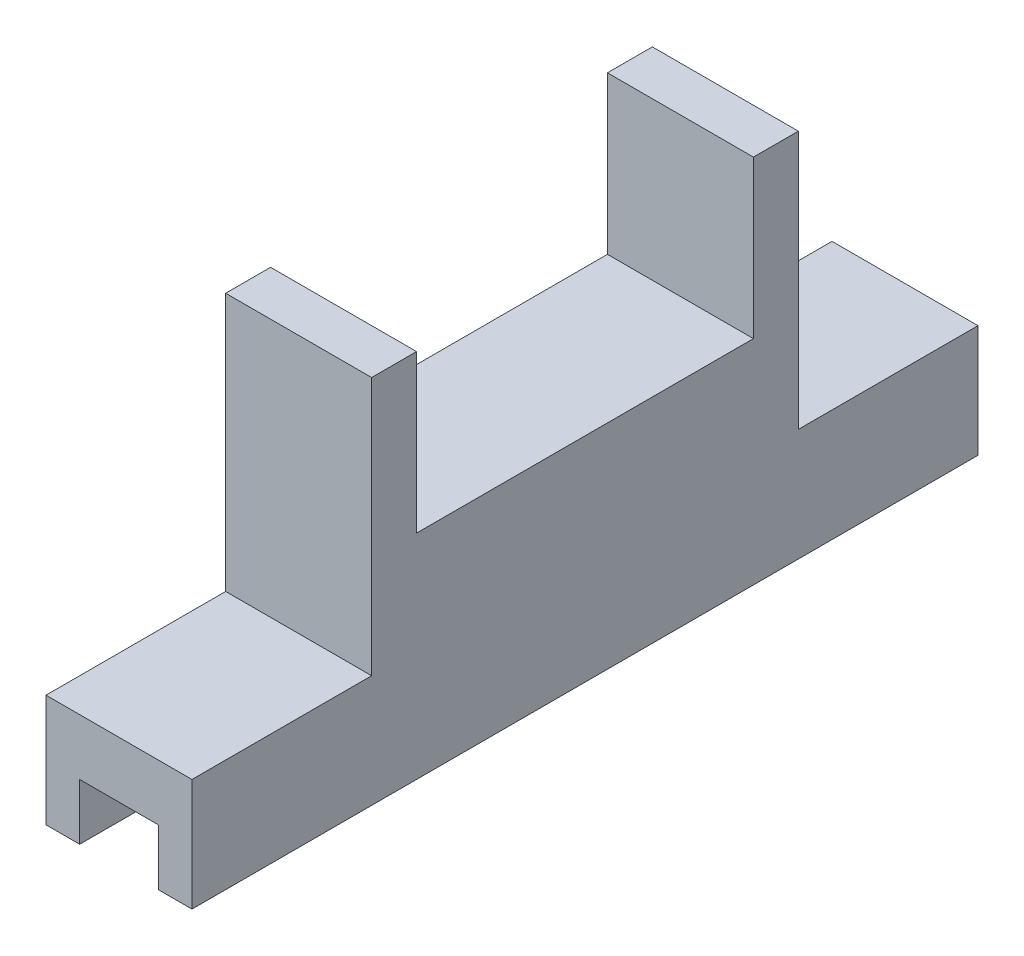
ISO-10303-21;
HEADER;
FILE_DESCRIPTION(('STEP AP214'),'2;1');
FILE_NAME('part.step','',(''),(''),'','','');
FILE_SCHEMA(('AUTOMOTIVE_DESIGN { 1 0 10303 214 1 1 1 1 }'));
ENDSEC;
DATA;
#1=APPLICATION_CONTEXT('core data for automotive mechanical design processes');
#2=APPLICATION_PROTOCOL_DEFINITION('international standard','automotive_design',2000,#1);
#3=PRODUCT_CONTEXT('',#1,'mechanical');
#4=PRODUCT('Part','Part','',(#3));
#5=PRODUCT_RELATED_PRODUCT_CATEGORY('part','',(#4));
#6=PRODUCT_DEFINITION_FORMATION('','',#4);
#7=PRODUCT_DEFINITION_CONTEXT('part definition',#1,'design');
#8=PRODUCT_DEFINITION('design','',#6,#7);
#9=PRODUCT_DEFINITION_SHAPE('','',#8);
#10=(LENGTH_UNIT() NAMED_UNIT(*) SI_UNIT(.MILLI.,.METRE.));
#11=(NAMED_UNIT(*) PLANE_ANGLE_UNIT() SI_UNIT($,.RADIAN.));
#12=(NAMED_UNIT(*) SI_UNIT($,.STERADIAN.) SOLID_ANGLE_UNIT());
#13=UNCERTAINTY_MEASURE_WITH_UNIT(LENGTH_MEASURE(1.E-05),#10,'distance_accuracy_value','');
#14=(GEOMETRIC_REPRESENTATION_CONTEXT(3) GLOBAL_UNCERTAINTY_ASSIGNED_CONTEXT((#13)) GLOBAL_UNIT_ASSIGNED_CONTEXT((#10,
#11,#12)) REPRESENTATION_CONTEXT('',''));
#15=CARTESIAN_POINT('',(0.,0.,0.));
#16=DIRECTION('',(0.,0.,1.));
#17=DIRECTION('',(1.,0.,0.));
#18=AXIS2_PLACEMENT_3D('',#15,#16,#17);
#19=CARTESIAN_POINT('',(0.,6.,0.));
#20=DIRECTION('',(0.,1.,0.));
#21=DIRECTION('',(0.,0.,1.));
#22=AXIS2_PLACEMENT_3D('',#19,#20,#21);
#23=PLANE('',#22);
#24=DIRECTION('',(0.,0.,-1.));
#25=VECTOR('',#24,1.);
#26=CARTESIAN_POINT('',(-15.6062671113895,6.,-27.7441860465116));
#27=LINE('',#26,#25);
#28=CARTESIAN_POINT('',(-15.6062671113895,6.,7.25581395348837));
#29=VERTEX_POINT('',#28);
#30=CARTESIAN_POINT('',(-15.6062671113895,6.,-0.744186046511637));
#31=VERTEX_POINT('',#30);
#32=EDGE_CURVE('E203',#29,#31,#27,.T.);
#33=ORIENTED_EDGE('',*,*,#32,.T.);
#34=DIRECTION('',(1.,0.,0.));
#35=VECTOR('',#34,1.);
#36=CARTESIAN_POINT('',(-15.6062671113895,6.,-0.744186046511637));
#37=LINE('',#36,#35);
#38=CARTESIAN_POINT('',(-22.1062671113895,6.,-0.744186046511637));
#39=VERTEX_POINT('',#38);
#40=EDGE_CURVE('E236',#39,#31,#37,.T.);
#41=ORIENTED_EDGE('',*,*,#40,.F.);
#42=DIRECTION('',(0.,0.,1.));
#43=VECTOR('',#42,1.);
#44=CARTESIAN_POINT('',(-22.1062671113895,6.,-27.7441860465116));
#45=LINE('',#44,#43);
#46=CARTESIAN_POINT('',(-22.1062671113895,6.,7.25581395348837));
#47=VERTEX_POINT('',#46);
#48=EDGE_CURVE('E197',#39,#47,#45,.T.);
#49=ORIENTED_EDGE('',*,*,#48,.T.);
#50=DIRECTION('',(1.,0.,0.));
#51=VECTOR('',#50,1.);
#52=CARTESIAN_POINT('',(-22.1062671113895,6.,7.25581395348837));
#53=LINE('',#52,#51);
#54=EDGE_CURVE('E200',#47,#29,#53,.T.);
#55=ORIENTED_EDGE('',*,*,#54,.T.);
#56=EDGE_LOOP('',(#33,#41,#49,#55));
#57=FACE_BOUND('',#56,.T.);
#58=ADVANCED_FACE('F34',(#57),#23,.T.);
#59=CARTESIAN_POINT('',(-22.1062671113895,6.,-27.7441860465116));
#60=VERTEX_POINT('',#59);
#61=CARTESIAN_POINT('',(-22.1062671113895,6.,-19.7441860465116));
#62=VERTEX_POINT('',#61);
#63=EDGE_CURVE('E198',#60,#62,#45,.T.);
#64=ORIENTED_EDGE('',*,*,#63,.T.);
#65=DIRECTION('',(-1.,0.,0.));
#66=VECTOR('',#65,1.);
#67=CARTESIAN_POINT('',(-15.6062671113895,6.,-19.7441860465116));
#68=LINE('',#67,#66);
#69=CARTESIAN_POINT('',(-15.6062671113895,6.,-19.7441860465116));
#70=VERTEX_POINT('',#69);
#71=EDGE_CURVE('E262',#70,#62,#68,.T.);
#72=ORIENTED_EDGE('',*,*,#71,.F.);
#73=CARTESIAN_POINT('',(-15.6062671113895,6.,-27.7441860465116));
#74=VERTEX_POINT('',#73);
#75=EDGE_CURVE('E202',#70,#74,#27,.T.);
#76=ORIENTED_EDGE('',*,*,#75,.T.);
#77=DIRECTION('',(-1.,0.,0.));
#78=VECTOR('',#77,1.);
#79=CARTESIAN_POINT('',(-22.1062671113895,6.,-27.7441860465116));
#80=LINE('',#79,#78);
#81=EDGE_CURVE('E57',#74,#60,#80,.T.);
#82=ORIENTED_EDGE('',*,*,#81,.T.);
#83=EDGE_LOOP('',(#64,#72,#76,#82));
#84=FACE_BOUND('',#83,.T.);
#85=ADVANCED_FACE('F287',(#84),#23,.T.);
#86=CARTESIAN_POINT('',(-22.1062671113895,6.,-27.7441860465116));
#87=DIRECTION('',(1.,0.,0.));
#88=DIRECTION('',(0.,0.,-1.));
#89=AXIS2_PLACEMENT_3D('',#86,#87,#88);
#90=PLANE('',#89);
#91=ORIENTED_EDGE('',*,*,#48,.F.);
#92=DIRECTION('',(0.,-1.,0.));
#93=VECTOR('',#92,1.);
#94=CARTESIAN_POINT('',(-22.1062671113895,17.5,-0.744186046511637));
#95=LINE('',#94,#93);
#96=CARTESIAN_POINT('',(-22.1062671113895,17.5,-0.744186046511637));
#97=VERTEX_POINT('',#96);
#98=EDGE_CURVE('E255',#97,#39,#95,.T.);
#99=ORIENTED_EDGE('',*,*,#98,.F.);
#100=DIRECTION('',(0.,0.,1.));
#101=VECTOR('',#100,1.);
#102=CARTESIAN_POINT('',(-22.1062671113895,17.5,-2.74418604651164));
#103=LINE('',#102,#101);
#104=CARTESIAN_POINT('',(-22.1062671113895,17.5,-2.74418604651164));
#105=VERTEX_POINT('',#104);
#106=EDGE_CURVE('E247',#105,#97,#103,.T.);
#107=ORIENTED_EDGE('',*,*,#106,.F.);
#108=DIRECTION('',(0.,-1.,0.));
#109=VECTOR('',#108,1.);
#110=CARTESIAN_POINT('',(-22.1062671113895,17.5,-2.74418604651164));
#111=LINE('',#110,#109);
#112=CARTESIAN_POINT('',(-22.1062671113895,10.5,-2.74418604651164));
#113=VERTEX_POINT('',#112);
#114=EDGE_CURVE('E257',#105,#113,#111,.T.);
#115=ORIENTED_EDGE('',*,*,#114,.T.);
#116=DIRECTION('',(0.,0.,1.));
#117=VECTOR('',#116,1.);
#118=CARTESIAN_POINT('',(-22.1062671113895,10.5,-17.7441860465116));
#119=LINE('',#118,#117);
#120=CARTESIAN_POINT('',(-22.1062671113895,10.5,-17.7441860465116));
#121=VERTEX_POINT('',#120);
#122=EDGE_CURVE('E185',#121,#113,#119,.T.);
#123=ORIENTED_EDGE('',*,*,#122,.F.);
#124=DIRECTION('',(0.,-1.,0.));
#125=VECTOR('',#124,1.);
#126=CARTESIAN_POINT('',(-22.1062671113895,17.5,-17.7441860465116));
#127=LINE('',#126,#125);
#128=CARTESIAN_POINT('',(-22.1062671113895,17.5,-17.7441860465116));
#129=VERTEX_POINT('',#128);
#130=EDGE_CURVE('E276',#129,#121,#127,.T.);
#131=ORIENTED_EDGE('',*,*,#130,.F.);
#132=DIRECTION('',(0.,0.,1.));
#133=VECTOR('',#132,1.);
#134=CARTESIAN_POINT('',(-22.1062671113895,17.5,-19.7441860465116));
#135=LINE('',#134,#133);
#136=CARTESIAN_POINT('',(-22.1062671113895,17.5,-19.7441860465116));
#137=VERTEX_POINT('',#136);
#138=EDGE_CURVE('E268',#137,#129,#135,.T.);
#139=ORIENTED_EDGE('',*,*,#138,.F.);
#140=DIRECTION('',(0.,-1.,0.));
#141=VECTOR('',#140,1.);
#142=CARTESIAN_POINT('',(-22.1062671113895,17.5,-19.7441860465116));
#143=LINE('',#142,#141);
#144=EDGE_CURVE('E277',#137,#62,#143,.T.);
#145=ORIENTED_EDGE('',*,*,#144,.T.);
#146=ORIENTED_EDGE('',*,*,#63,.F.);
#147=DIRECTION('',(0.,-1.,0.));
#148=VECTOR('',#147,1.);
#149=CARTESIAN_POINT('',(-22.1062671113895,6.,-27.7441860465116));
#150=LINE('',#149,#148);
#151=CARTESIAN_POINT('',(-22.1062671113895,1.,-27.7441860465116));
#152=VERTEX_POINT('',#151);
#153=EDGE_CURVE('E207',#60,#152,#150,.T.);
#154=ORIENTED_EDGE('',*,*,#153,.T.);
#155=DIRECTION('',(0.,0.,1.));
#156=VECTOR('',#155,1.);
#157=CARTESIAN_POINT('',(-22.1062671113895,1.,-496.244186046512));
#158=LINE('',#157,#156);
#159=CARTESIAN_POINT('',(-22.1062671113895,1.,7.25581395348837));
#160=VERTEX_POINT('',#159);
#161=EDGE_CURVE('E174',#152,#160,#158,.T.);
#162=ORIENTED_EDGE('',*,*,#161,.T.);
#163=DIRECTION('',(0.,-1.,0.));
#164=VECTOR('',#163,1.);
#165=CARTESIAN_POINT('',(-22.1062671113895,6.,7.25581395348837));
#166=LINE('',#165,#164);
#167=EDGE_CURVE('E215',#47,#160,#166,.T.);
#168=ORIENTED_EDGE('',*,*,#167,.F.);
#169=EDGE_LOOP('',(#91,#99,#107,#115,#123,#131,#139,#145,#146,#154,#162,#168));
#170=FACE_BOUND('',#169,.T.);
#171=ADVANCED_FACE('F36',(#170),#90,.F.);
#172=CARTESIAN_POINT('',(-22.1062671113895,6.,7.25581395348837));
#173=DIRECTION('',(0.,0.,-1.));
#174=DIRECTION('',(-1.,0.,0.));
#175=AXIS2_PLACEMENT_3D('',#172,#173,#174);
#176=PLANE('',#175);
#177=DIRECTION('',(-1.,0.,0.));
#178=VECTOR('',#177,1.);
#179=CARTESIAN_POINT('',(-22.1062671113895,1.,7.25581395348837));
#180=LINE('',#179,#178);
#181=CARTESIAN_POINT('',(-20.6062671113895,1.,7.25581395348837));
#182=VERTEX_POINT('',#181);
#183=EDGE_CURVE('E172',#182,#160,#180,.T.);
#184=ORIENTED_EDGE('',*,*,#183,.F.);
#185=DIRECTION('',(0.,-1.,0.));
#186=VECTOR('',#185,1.);
#187=CARTESIAN_POINT('',(-20.6062671113895,3.5,7.25581395348837));
#188=LINE('',#187,#186);
#189=CARTESIAN_POINT('',(-20.6062671113895,3.5,7.25581395348837));
#190=VERTEX_POINT('',#189);
#191=EDGE_CURVE('E49',#190,#182,#188,.T.);
#192=ORIENTED_EDGE('',*,*,#191,.F.);
#193=DIRECTION('',(-1.,0.,0.));
#194=VECTOR('',#193,1.);
#195=CARTESIAN_POINT('',(-20.6062671113895,3.5,7.25581395348837));
#196=LINE('',#195,#194);
#197=CARTESIAN_POINT('',(-17.1062671113895,3.5,7.25581395348837));
#198=VERTEX_POINT('',#197);
#199=EDGE_CURVE('E167',#198,#190,#196,.T.);
#200=ORIENTED_EDGE('',*,*,#199,.F.);
#201=DIRECTION('',(0.,1.,0.));
#202=VECTOR('',#201,1.);
#203=CARTESIAN_POINT('',(-17.1062671113895,3.5,7.25581395348837));
#204=LINE('',#203,#202);
#205=CARTESIAN_POINT('',(-17.1062671113895,1.,7.25581395348837));
#206=VERTEX_POINT('',#205);
#207=EDGE_CURVE('E151',#206,#198,#204,.T.);
#208=ORIENTED_EDGE('',*,*,#207,.F.);
#209=CARTESIAN_POINT('',(-15.6062671113895,1.,7.25581395348837));
#210=VERTEX_POINT('',#209);
#211=EDGE_CURVE('E164',#210,#206,#180,.T.);
#212=ORIENTED_EDGE('',*,*,#211,.F.);
#213=DIRECTION('',(0.,-1.,0.));
#214=VECTOR('',#213,1.);
#215=CARTESIAN_POINT('',(-15.6062671113895,6.,7.25581395348837));
#216=LINE('',#215,#214);
#217=EDGE_CURVE('E213',#29,#210,#216,.T.);
#218=ORIENTED_EDGE('',*,*,#217,.F.);
#219=ORIENTED_EDGE('',*,*,#54,.F.);
#220=ORIENTED_EDGE('',*,*,#167,.T.);
#221=EDGE_LOOP('',(#184,#192,#200,#208,#212,#218,#219,#220));
#222=FACE_BOUND('',#221,.T.);
#223=ADVANCED_FACE('F162',(#222),#176,.F.);
#224=CARTESIAN_POINT('',(-15.6062671113895,6.,-27.7441860465116));
#225=DIRECTION('',(-1.,0.,0.));
#226=DIRECTION('',(0.,0.,1.));
#227=AXIS2_PLACEMENT_3D('',#224,#225,#226);
#228=PLANE('',#227);
#229=ORIENTED_EDGE('',*,*,#75,.F.);
#230=DIRECTION('',(0.,-1.,0.));
#231=VECTOR('',#230,1.);
#232=CARTESIAN_POINT('',(-15.6062671113895,17.5,-19.7441860465116));
#233=LINE('',#232,#231);
#234=CARTESIAN_POINT('',(-15.6062671113895,17.5,-19.7441860465116));
#235=VERTEX_POINT('',#234);
#236=EDGE_CURVE('E176',#235,#70,#233,.T.);
#237=ORIENTED_EDGE('',*,*,#236,.F.);
#238=DIRECTION('',(0.,0.,-1.));
#239=VECTOR('',#238,1.);
#240=CARTESIAN_POINT('',(-15.6062671113895,17.5,-19.7441860465116));
#241=LINE('',#240,#239);
#242=CARTESIAN_POINT('',(-15.6062671113895,17.5,-17.7441860465116));
#243=VERTEX_POINT('',#242);
#244=EDGE_CURVE('E263',#243,#235,#241,.T.);
#245=ORIENTED_EDGE('',*,*,#244,.F.);
#246=DIRECTION('',(0.,-1.,0.));
#247=VECTOR('',#246,1.);
#248=CARTESIAN_POINT('',(-15.6062671113895,17.5,-17.7441860465116));
#249=LINE('',#248,#247);
#250=CARTESIAN_POINT('',(-15.6062671113895,10.5,-17.7441860465116));
#251=VERTEX_POINT('',#250);
#252=EDGE_CURVE('E272',#243,#251,#249,.T.);
#253=ORIENTED_EDGE('',*,*,#252,.T.);
#254=DIRECTION('',(0.,0.,-1.));
#255=VECTOR('',#254,1.);
#256=CARTESIAN_POINT('',(-15.6062671113895,10.5,-17.7441860465116));
#257=LINE('',#256,#255);
#258=CARTESIAN_POINT('',(-15.6062671113895,10.5,-2.74418604651164));
#259=VERTEX_POINT('',#258);
#260=EDGE_CURVE('E191',#259,#251,#257,.T.);
#261=ORIENTED_EDGE('',*,*,#260,.F.);
#262=DIRECTION('',(0.,-1.,0.));
#263=VECTOR('',#262,1.);
#264=CARTESIAN_POINT('',(-15.6062671113895,17.5,-2.74418604651164));
#265=LINE('',#264,#263);
#266=CARTESIAN_POINT('',(-15.6062671113895,17.5,-2.74418604651164));
#267=VERTEX_POINT('',#266);
#268=EDGE_CURVE('E260',#267,#259,#265,.T.);
#269=ORIENTED_EDGE('',*,*,#268,.F.);
#270=DIRECTION('',(0.,0.,-1.));
#271=VECTOR('',#270,1.);
#272=CARTESIAN_POINT('',(-15.6062671113895,17.5,-2.74418604651164));
#273=LINE('',#272,#271);
#274=CARTESIAN_POINT('',(-15.6062671113895,17.5,-0.744186046511637));
#275=VERTEX_POINT('',#274);
#276=EDGE_CURVE('E242',#275,#267,#273,.T.);
#277=ORIENTED_EDGE('',*,*,#276,.F.);
#278=DIRECTION('',(0.,-1.,0.));
#279=VECTOR('',#278,1.);
#280=CARTESIAN_POINT('',(-15.6062671113895,17.5,-0.744186046511637));
#281=LINE('',#280,#279);
#282=EDGE_CURVE('E251',#275,#31,#281,.T.);
#283=ORIENTED_EDGE('',*,*,#282,.T.);
#284=ORIENTED_EDGE('',*,*,#32,.F.);
#285=ORIENTED_EDGE('',*,*,#217,.T.);
#286=DIRECTION('',(0.,0.,1.));
#287=VECTOR('',#286,1.);
#288=CARTESIAN_POINT('',(-15.6062671113895,1.,-496.244186046512));
#289=LINE('',#288,#287);
#290=CARTESIAN_POINT('',(-15.6062671113895,1.,-27.7441860465116));
#291=VERTEX_POINT('',#290);
#292=EDGE_CURVE('E171',#291,#210,#289,.T.);
#293=ORIENTED_EDGE('',*,*,#292,.F.);
#294=DIRECTION('',(0.,-1.,0.));
#295=VECTOR('',#294,1.);
#296=CARTESIAN_POINT('',(-15.6062671113895,6.,-27.7441860465116));
#297=LINE('',#296,#295);
#298=EDGE_CURVE('E210',#74,#291,#297,.T.);
#299=ORIENTED_EDGE('',*,*,#298,.F.);
#300=EDGE_LOOP('',(#229,#237,#245,#253,#261,#269,#277,#283,#284,#285,#293,#299));
#301=FACE_BOUND('',#300,.T.);
#302=ADVANCED_FACE('F289',(#301),#228,.F.);
#303=CARTESIAN_POINT('',(-22.1062671113895,6.,-27.7441860465116));
#304=DIRECTION('',(0.,0.,1.));
#305=DIRECTION('',(1.,0.,0.));
#306=AXIS2_PLACEMENT_3D('',#303,#304,#305);
#307=PLANE('',#306);
#308=DIRECTION('',(-1.,0.,0.));
#309=VECTOR('',#308,1.);
#310=CARTESIAN_POINT('',(-22.1062671113895,3.5,-27.7441860465116));
#311=LINE('',#310,#309);
#312=CARTESIAN_POINT('',(-17.1062671113895,3.5,-27.7441860465116));
#313=VERTEX_POINT('',#312);
#314=CARTESIAN_POINT('',(-20.6062671113895,3.5,-27.7441860465116));
#315=VERTEX_POINT('',#314);
#316=EDGE_CURVE('E11',#313,#315,#311,.T.);
#317=ORIENTED_EDGE('',*,*,#316,.T.);
#318=DIRECTION('',(0.,-1.,0.));
#319=VECTOR('',#318,1.);
#320=CARTESIAN_POINT('',(-20.6062671113895,6.,-27.7441860465116));
#321=LINE('',#320,#319);
#322=CARTESIAN_POINT('',(-20.6062671113895,1.,-27.7441860465117));
#323=VERTEX_POINT('',#322);
#324=EDGE_CURVE('E232',#315,#323,#321,.T.);
#325=ORIENTED_EDGE('',*,*,#324,.T.);
#326=DIRECTION('',(-1.,0.,0.));
#327=VECTOR('',#326,1.);
#328=CARTESIAN_POINT('',(-22.1062671113895,1.,-27.7441860465116));
#329=LINE('',#328,#327);
#330=EDGE_CURVE('E184',#323,#152,#329,.T.);
#331=ORIENTED_EDGE('',*,*,#330,.T.);
#332=ORIENTED_EDGE('',*,*,#153,.F.);
#333=ORIENTED_EDGE('',*,*,#81,.F.);
#334=ORIENTED_EDGE('',*,*,#298,.T.);
#335=CARTESIAN_POINT('',(-17.1062671113895,1.,-27.7441860465117));
#336=VERTEX_POINT('',#335);
#337=EDGE_CURVE('E181',#291,#336,#329,.T.);
#338=ORIENTED_EDGE('',*,*,#337,.T.);
#339=DIRECTION('',(0.,1.,0.));
#340=VECTOR('',#339,1.);
#341=CARTESIAN_POINT('',(-17.1062671113895,6.,-27.7441860465116));
#342=LINE('',#341,#340);
#343=EDGE_CURVE('E154',#336,#313,#342,.T.);
#344=ORIENTED_EDGE('',*,*,#343,.T.);
#345=EDGE_LOOP('',(#317,#325,#331,#332,#333,#334,#338,#344));
#346=FACE_BOUND('',#345,.T.);
#347=ADVANCED_FACE('F231',(#346),#307,.F.);
#348=CARTESIAN_POINT('',(0.,10.5,0.));
#349=DIRECTION('',(0.,1.,0.));
#350=DIRECTION('',(0.,0.,1.));
#351=AXIS2_PLACEMENT_3D('',#348,#349,#350);
#352=PLANE('',#351);
#353=ORIENTED_EDGE('',*,*,#122,.T.);
#354=DIRECTION('',(1.,0.,0.));
#355=VECTOR('',#354,1.);
#356=CARTESIAN_POINT('',(-22.1062671113895,10.5,-2.74418604651164));
#357=LINE('',#356,#355);
#358=EDGE_CURVE('E188',#113,#259,#357,.T.);
#359=ORIENTED_EDGE('',*,*,#358,.T.);
#360=ORIENTED_EDGE('',*,*,#260,.T.);
#361=DIRECTION('',(-1.,0.,0.));
#362=VECTOR('',#361,1.);
#363=CARTESIAN_POINT('',(-22.1062671113895,10.5,-17.7441860465116));
#364=LINE('',#363,#362);
#365=EDGE_CURVE('E194',#251,#121,#364,.T.);
#366=ORIENTED_EDGE('',*,*,#365,.T.);
#367=EDGE_LOOP('',(#353,#359,#360,#366));
#368=FACE_BOUND('',#367,.T.);
#369=ADVANCED_FACE('F308',(#368),#352,.T.);
#370=CARTESIAN_POINT('',(-22.1062671113895,1.,-496.244186046512));
#371=DIRECTION('',(0.,1.,0.));
#372=DIRECTION('',(0.,0.,1.));
#373=AXIS2_PLACEMENT_3D('',#370,#371,#372);
#374=PLANE('',#373);
#375=ORIENTED_EDGE('',*,*,#211,.T.);
#376=DIRECTION('',(0.,0.,-1.));
#377=VECTOR('',#376,1.);
#378=CARTESIAN_POINT('',(-17.1062671113895,1.,-496.244186046512));
#379=LINE('',#378,#377);
#380=EDGE_CURVE('E42',#206,#336,#379,.T.);
#381=ORIENTED_EDGE('',*,*,#380,.T.);
#382=ORIENTED_EDGE('',*,*,#337,.F.);
#383=ORIENTED_EDGE('',*,*,#292,.T.);
#384=EDGE_LOOP('',(#375,#381,#382,#383));
#385=FACE_BOUND('',#384,.T.);
#386=ADVANCED_FACE('F169',(#385),#374,.F.);
#387=ORIENTED_EDGE('',*,*,#330,.F.);
#388=DIRECTION('',(0.,0.,1.));
#389=VECTOR('',#388,1.);
#390=CARTESIAN_POINT('',(-20.6062671113895,1.,-496.244186046512));
#391=LINE('',#390,#389);
#392=EDGE_CURVE('E158',#323,#182,#391,.T.);
#393=ORIENTED_EDGE('',*,*,#392,.T.);
#394=ORIENTED_EDGE('',*,*,#183,.T.);
#395=ORIENTED_EDGE('',*,*,#161,.F.);
#396=EDGE_LOOP('',(#387,#393,#394,#395));
#397=FACE_BOUND('',#396,.T.);
#398=ADVANCED_FACE('F220',(#397),#374,.F.);
#399=CARTESIAN_POINT('',(-15.6062671113895,17.5,-19.7441860465116));
#400=DIRECTION('',(0.,0.,1.));
#401=DIRECTION('',(1.,0.,0.));
#402=AXIS2_PLACEMENT_3D('',#399,#400,#401);
#403=PLANE('',#402);
#404=ORIENTED_EDGE('',*,*,#71,.T.);
#405=ORIENTED_EDGE('',*,*,#144,.F.);
#406=DIRECTION('',(-1.,0.,0.));
#407=VECTOR('',#406,1.);
#408=CARTESIAN_POINT('',(-15.6062671113895,17.5,-19.7441860465116));
#409=LINE('',#408,#407);
#410=EDGE_CURVE('E266',#235,#137,#409,.T.);
#411=ORIENTED_EDGE('',*,*,#410,.F.);
#412=ORIENTED_EDGE('',*,*,#236,.T.);
#413=EDGE_LOOP('',(#404,#405,#411,#412));
#414=FACE_BOUND('',#413,.T.);
#415=ADVANCED_FACE('F283',(#414),#403,.F.);
#416=CARTESIAN_POINT('',(-15.6062671113895,17.5,-17.7441860465116));
#417=DIRECTION('',(0.,0.,-1.));
#418=DIRECTION('',(-1.,0.,0.));
#419=AXIS2_PLACEMENT_3D('',#416,#417,#418);
#420=PLANE('',#419);
#421=ORIENTED_EDGE('',*,*,#365,.F.);
#422=ORIENTED_EDGE('',*,*,#252,.F.);
#423=DIRECTION('',(1.,0.,0.));
#424=VECTOR('',#423,1.);
#425=CARTESIAN_POINT('',(-15.6062671113895,17.5,-17.7441860465116));
#426=LINE('',#425,#424);
#427=EDGE_CURVE('E270',#129,#243,#426,.T.);
#428=ORIENTED_EDGE('',*,*,#427,.F.);
#429=ORIENTED_EDGE('',*,*,#130,.T.);
#430=EDGE_LOOP('',(#421,#422,#428,#429));
#431=FACE_BOUND('',#430,.T.);
#432=ADVANCED_FACE('F312',(#431),#420,.F.);
#433=CARTESIAN_POINT('',(0.,17.5,0.));
#434=DIRECTION('',(0.,-1.,0.));
#435=DIRECTION('',(0.,0.,-1.));
#436=AXIS2_PLACEMENT_3D('',#433,#434,#435);
#437=PLANE('',#436);
#438=ORIENTED_EDGE('',*,*,#244,.T.);
#439=ORIENTED_EDGE('',*,*,#410,.T.);
#440=ORIENTED_EDGE('',*,*,#138,.T.);
#441=ORIENTED_EDGE('',*,*,#427,.T.);
#442=EDGE_LOOP('',(#438,#439,#440,#441));
#443=FACE_BOUND('',#442,.T.);
#444=ADVANCED_FACE('F315',(#443),#437,.F.);
#445=CARTESIAN_POINT('',(-15.6062671113895,17.5,-2.74418604651164));
#446=DIRECTION('',(0.,0.,1.));
#447=DIRECTION('',(1.,0.,0.));
#448=AXIS2_PLACEMENT_3D('',#445,#446,#447);
#449=PLANE('',#448);
#450=ORIENTED_EDGE('',*,*,#358,.F.);
#451=ORIENTED_EDGE('',*,*,#114,.F.);
#452=DIRECTION('',(-1.,0.,0.));
#453=VECTOR('',#452,1.);
#454=CARTESIAN_POINT('',(-15.6062671113895,17.5,-2.74418604651164));
#455=LINE('',#454,#453);
#456=EDGE_CURVE('E245',#267,#105,#455,.T.);
#457=ORIENTED_EDGE('',*,*,#456,.F.);
#458=ORIENTED_EDGE('',*,*,#268,.T.);
#459=EDGE_LOOP('',(#450,#451,#457,#458));
#460=FACE_BOUND('',#459,.T.);
#461=ADVANCED_FACE('F305',(#460),#449,.F.);
#462=CARTESIAN_POINT('',(-15.6062671113895,17.5,-0.744186046511637));
#463=DIRECTION('',(0.,0.,-1.));
#464=DIRECTION('',(-1.,0.,0.));
#465=AXIS2_PLACEMENT_3D('',#462,#463,#464);
#466=PLANE('',#465);
#467=ORIENTED_EDGE('',*,*,#40,.T.);
#468=ORIENTED_EDGE('',*,*,#282,.F.);
#469=DIRECTION('',(1.,0.,0.));
#470=VECTOR('',#469,1.);
#471=CARTESIAN_POINT('',(-15.6062671113895,17.5,-0.744186046511637));
#472=LINE('',#471,#470);
#473=EDGE_CURVE('E249',#97,#275,#472,.T.);
#474=ORIENTED_EDGE('',*,*,#473,.F.);
#475=ORIENTED_EDGE('',*,*,#98,.T.);
#476=EDGE_LOOP('',(#467,#468,#474,#475));
#477=FACE_BOUND('',#476,.T.);
#478=ADVANCED_FACE('F296',(#477),#466,.F.);
#479=CARTESIAN_POINT('',(0.,17.5,0.));
#480=DIRECTION('',(0.,-1.,0.));
#481=DIRECTION('',(0.,0.,-1.));
#482=AXIS2_PLACEMENT_3D('',#479,#480,#481);
#483=PLANE('',#482);
#484=ORIENTED_EDGE('',*,*,#276,.T.);
#485=ORIENTED_EDGE('',*,*,#456,.T.);
#486=ORIENTED_EDGE('',*,*,#106,.T.);
#487=ORIENTED_EDGE('',*,*,#473,.T.);
#488=EDGE_LOOP('',(#484,#485,#486,#487));
#489=FACE_BOUND('',#488,.T.);
#490=ADVANCED_FACE('F302',(#489),#483,.F.);
#491=CARTESIAN_POINT('',(-20.6062671113895,3.5,-83.2441860465117));
#492=DIRECTION('',(0.,1.,0.));
#493=DIRECTION('',(0.,0.,1.));
#494=AXIS2_PLACEMENT_3D('',#491,#492,#493);
#495=PLANE('',#494);
#496=DIRECTION('',(0.,0.,1.));
#497=VECTOR('',#496,1.);
#498=CARTESIAN_POINT('',(-17.1062671113895,3.5,-83.2441860465117));
#499=LINE('',#498,#497);
#500=EDGE_CURVE('E238',#313,#198,#499,.T.);
#501=ORIENTED_EDGE('',*,*,#500,.T.);
#502=ORIENTED_EDGE('',*,*,#199,.T.);
#503=DIRECTION('',(0.,0.,1.));
#504=VECTOR('',#503,1.);
#505=CARTESIAN_POINT('',(-20.6062671113895,3.5,-83.2441860465117));
#506=LINE('',#505,#504);
#507=EDGE_CURVE('E234',#315,#190,#506,.T.);
#508=ORIENTED_EDGE('',*,*,#507,.F.);
#509=ORIENTED_EDGE('',*,*,#316,.F.);
#510=EDGE_LOOP('',(#501,#502,#508,#509));
#511=FACE_BOUND('',#510,.T.);
#512=ADVANCED_FACE('F400',(#511),#495,.F.);
#513=CARTESIAN_POINT('',(-17.1062671113895,3.5,-83.2441860465117));
#514=DIRECTION('',(1.,0.,0.));
#515=DIRECTION('',(0.,0.,-1.));
#516=AXIS2_PLACEMENT_3D('',#513,#514,#515);
#517=PLANE('',#516);
#518=ORIENTED_EDGE('',*,*,#380,.F.);
#519=ORIENTED_EDGE('',*,*,#207,.T.);
#520=ORIENTED_EDGE('',*,*,#500,.F.);
#521=ORIENTED_EDGE('',*,*,#343,.F.);
#522=EDGE_LOOP('',(#518,#519,#520,#521));
#523=FACE_BOUND('',#522,.T.);
#524=ADVANCED_FACE('F149',(#523),#517,.F.);
#525=CARTESIAN_POINT('',(-20.6062671113895,3.5,-83.2441860465117));
#526=DIRECTION('',(-1.,0.,0.));
#527=DIRECTION('',(0.,0.,1.));
#528=AXIS2_PLACEMENT_3D('',#525,#526,#527);
#529=PLANE('',#528);
#530=ORIENTED_EDGE('',*,*,#507,.T.);
#531=ORIENTED_EDGE('',*,*,#191,.T.);
#532=ORIENTED_EDGE('',*,*,#392,.F.);
#533=ORIENTED_EDGE('',*,*,#324,.F.);
#534=EDGE_LOOP('',(#530,#531,#532,#533));
#535=FACE_BOUND('',#534,.T.);
#536=ADVANCED_FACE('F417',(#535),#529,.F.);
#537=CLOSED_SHELL('',(#58,#85,#171,#223,#302,#347,#369,#386,#398,#415,#432,#444,#461,#478,#490,
#512,#524,#536));
#538=MANIFOLD_SOLID_BREP('B2',#537);
#539=ADVANCED_BREP_SHAPE_REPRESENTATION('',(#18,#538),#14);
#540=SHAPE_DEFINITION_REPRESENTATION(#9,#539);
ENDSEC;
END-ISO-10303-21;
